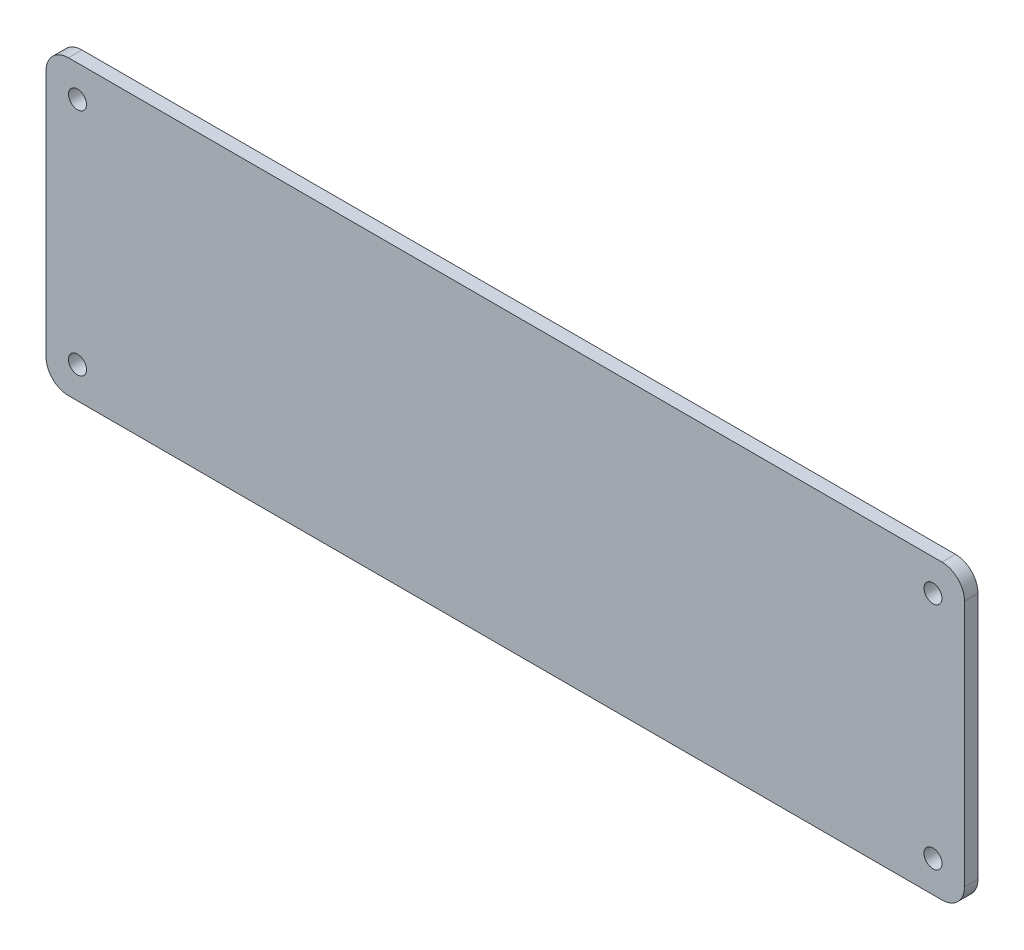
ISO-10303-21;
HEADER;
FILE_DESCRIPTION(('STEP AP214'),'2;1');
FILE_NAME('part.step','',(''),(''),'','','');
FILE_SCHEMA(('AUTOMOTIVE_DESIGN { 1 0 10303 214 1 1 1 1 }'));
ENDSEC;
DATA;
#1=APPLICATION_CONTEXT('core data for automotive mechanical design processes');
#2=APPLICATION_PROTOCOL_DEFINITION('international standard','automotive_design',2000,#1);
#3=PRODUCT_CONTEXT('',#1,'mechanical');
#4=PRODUCT('Part','Part','',(#3));
#5=PRODUCT_RELATED_PRODUCT_CATEGORY('part','',(#4));
#6=PRODUCT_DEFINITION_FORMATION('','',#4);
#7=PRODUCT_DEFINITION_CONTEXT('part definition',#1,'design');
#8=PRODUCT_DEFINITION('design','',#6,#7);
#9=PRODUCT_DEFINITION_SHAPE('','',#8);
#10=(LENGTH_UNIT() NAMED_UNIT(*) SI_UNIT(.MILLI.,.METRE.));
#11=(NAMED_UNIT(*) PLANE_ANGLE_UNIT() SI_UNIT($,.RADIAN.));
#12=(NAMED_UNIT(*) SI_UNIT($,.STERADIAN.) SOLID_ANGLE_UNIT());
#13=UNCERTAINTY_MEASURE_WITH_UNIT(LENGTH_MEASURE(1.E-05),#10,'distance_accuracy_value','');
#14=(GEOMETRIC_REPRESENTATION_CONTEXT(3) GLOBAL_UNCERTAINTY_ASSIGNED_CONTEXT((#13)) GLOBAL_UNIT_ASSIGNED_CONTEXT((#10,
#11,#12)) REPRESENTATION_CONTEXT('',''));
#15=CARTESIAN_POINT('',(0.,0.,0.));
#16=DIRECTION('',(0.,0.,1.));
#17=DIRECTION('',(1.,0.,0.));
#18=AXIS2_PLACEMENT_3D('',#15,#16,#17);
#19=CARTESIAN_POINT('',(0.,0.,1.5));
#20=DIRECTION('',(0.,0.,1.));
#21=DIRECTION('',(1.,0.,0.));
#22=AXIS2_PLACEMENT_3D('',#19,#20,#21);
#23=PLANE('',#22);
#24=CARTESIAN_POINT('',(-95.0000000000001,25.5,1.5));
#25=DIRECTION('',(0.,0.,1.));
#26=DIRECTION('',(1.,0.,0.));
#27=AXIS2_PLACEMENT_3D('',#24,#25,#26);
#28=CIRCLE('',#27,2.);
#29=CARTESIAN_POINT('',(-93.0000000000001,25.5,1.5));
#30=VERTEX_POINT('',#29);
#31=EDGE_CURVE('E199',#30,#30,#28,.T.);
#32=ORIENTED_EDGE('',*,*,#31,.F.);
#33=EDGE_LOOP('',(#32));
#34=FACE_BOUND('',#33,.T.);
#35=CARTESIAN_POINT('',(95.,-25.5,1.5));
#36=DIRECTION('',(0.,0.,1.));
#37=DIRECTION('',(1.,0.,0.));
#38=AXIS2_PLACEMENT_3D('',#35,#36,#37);
#39=CIRCLE('',#38,2.);
#40=CARTESIAN_POINT('',(97.,-25.5,1.5));
#41=VERTEX_POINT('',#40);
#42=EDGE_CURVE('E185',#41,#41,#39,.T.);
#43=ORIENTED_EDGE('',*,*,#42,.F.);
#44=EDGE_LOOP('',(#43));
#45=FACE_BOUND('',#44,.T.);
#46=DIRECTION('',(-1.,0.,0.));
#47=VECTOR('',#46,1.);
#48=CARTESIAN_POINT('',(-102.,32.5,1.5));
#49=LINE('',#48,#47);
#50=CARTESIAN_POINT('',(97.,32.5,1.5));
#51=VERTEX_POINT('',#50);
#52=CARTESIAN_POINT('',(-97.,32.5,1.5));
#53=VERTEX_POINT('',#52);
#54=EDGE_CURVE('E180',#51,#53,#49,.T.);
#55=ORIENTED_EDGE('',*,*,#54,.T.);
#56=CARTESIAN_POINT('',(-97.,27.5,1.5));
#57=DIRECTION('',(0.,0.,1.));
#58=DIRECTION('',(1.,0.,0.));
#59=AXIS2_PLACEMENT_3D('',#56,#57,#58);
#60=CIRCLE('',#59,5.);
#61=CARTESIAN_POINT('',(-102.,27.5,1.5));
#62=VERTEX_POINT('',#61);
#63=EDGE_CURVE('E161',#53,#62,#60,.T.);
#64=ORIENTED_EDGE('',*,*,#63,.T.);
#65=DIRECTION('',(0.,-1.,0.));
#66=VECTOR('',#65,1.);
#67=CARTESIAN_POINT('',(-102.,32.5,1.5));
#68=LINE('',#67,#66);
#69=CARTESIAN_POINT('',(-102.,-27.5,1.5));
#70=VERTEX_POINT('',#69);
#71=EDGE_CURVE('E131',#62,#70,#68,.T.);
#72=ORIENTED_EDGE('',*,*,#71,.T.);
#73=CARTESIAN_POINT('',(-97.,-27.5,1.5));
#74=DIRECTION('',(0.,0.,1.));
#75=DIRECTION('',(1.,0.,0.));
#76=AXIS2_PLACEMENT_3D('',#73,#74,#75);
#77=CIRCLE('',#76,5.);
#78=CARTESIAN_POINT('',(-97.,-32.5,1.5));
#79=VERTEX_POINT('',#78);
#80=EDGE_CURVE('E67',#70,#79,#77,.T.);
#81=ORIENTED_EDGE('',*,*,#80,.T.);
#82=DIRECTION('',(1.,0.,0.));
#83=VECTOR('',#82,1.);
#84=CARTESIAN_POINT('',(-102.,-32.5,1.5));
#85=LINE('',#84,#83);
#86=CARTESIAN_POINT('',(97.,-32.5,1.5));
#87=VERTEX_POINT('',#86);
#88=EDGE_CURVE('E147',#79,#87,#85,.T.);
#89=ORIENTED_EDGE('',*,*,#88,.T.);
#90=CARTESIAN_POINT('',(97.,-27.5,1.5));
#91=DIRECTION('',(0.,0.,1.));
#92=DIRECTION('',(1.,0.,0.));
#93=AXIS2_PLACEMENT_3D('',#90,#91,#92);
#94=CIRCLE('',#93,5.);
#95=CARTESIAN_POINT('',(102.,-27.5,1.5));
#96=VERTEX_POINT('',#95);
#97=EDGE_CURVE('E158',#87,#96,#94,.T.);
#98=ORIENTED_EDGE('',*,*,#97,.T.);
#99=DIRECTION('',(0.,1.,0.));
#100=VECTOR('',#99,1.);
#101=CARTESIAN_POINT('',(102.,32.5,1.5));
#102=LINE('',#101,#100);
#103=CARTESIAN_POINT('',(102.,27.5,1.5));
#104=VERTEX_POINT('',#103);
#105=EDGE_CURVE('E141',#96,#104,#102,.T.);
#106=ORIENTED_EDGE('',*,*,#105,.T.);
#107=CARTESIAN_POINT('',(97.,27.5,1.5));
#108=DIRECTION('',(0.,0.,1.));
#109=DIRECTION('',(1.,0.,0.));
#110=AXIS2_PLACEMENT_3D('',#107,#108,#109);
#111=CIRCLE('',#110,5.);
#112=EDGE_CURVE('E156',#104,#51,#111,.T.);
#113=ORIENTED_EDGE('',*,*,#112,.T.);
#114=EDGE_LOOP('',(#55,#64,#72,#81,#89,#98,#106,#113));
#115=FACE_BOUND('',#114,.T.);
#116=CARTESIAN_POINT('',(95.,25.5,1.5));
#117=DIRECTION('',(0.,0.,1.));
#118=DIRECTION('',(1.,0.,0.));
#119=AXIS2_PLACEMENT_3D('',#116,#117,#118);
#120=CIRCLE('',#119,2.);
#121=CARTESIAN_POINT('',(97.,25.5,1.5));
#122=VERTEX_POINT('',#121);
#123=EDGE_CURVE('E194',#122,#122,#120,.T.);
#124=ORIENTED_EDGE('',*,*,#123,.F.);
#125=EDGE_LOOP('',(#124));
#126=FACE_BOUND('',#125,.T.);
#127=CARTESIAN_POINT('',(-95.0000000000001,-25.5,1.5));
#128=DIRECTION('',(0.,0.,1.));
#129=DIRECTION('',(1.,0.,0.));
#130=AXIS2_PLACEMENT_3D('',#127,#128,#129);
#131=CIRCLE('',#130,2.);
#132=CARTESIAN_POINT('',(-93.0000000000001,-25.5,1.5));
#133=VERTEX_POINT('',#132);
#134=EDGE_CURVE('E205',#133,#133,#131,.T.);
#135=ORIENTED_EDGE('',*,*,#134,.F.);
#136=EDGE_LOOP('',(#135));
#137=FACE_BOUND('',#136,.T.);
#138=ADVANCED_FACE('F45',(#34,#45,#115,#126,#137),#23,.T.);
#139=CARTESIAN_POINT('',(0.,0.,-1.5));
#140=DIRECTION('',(0.,0.,1.));
#141=DIRECTION('',(1.,0.,0.));
#142=AXIS2_PLACEMENT_3D('',#139,#140,#141);
#143=PLANE('',#142);
#144=DIRECTION('',(0.,-1.,0.));
#145=VECTOR('',#144,1.);
#146=CARTESIAN_POINT('',(-102.,32.5,-1.5));
#147=LINE('',#146,#145);
#148=CARTESIAN_POINT('',(-102.,27.5,-1.5));
#149=VERTEX_POINT('',#148);
#150=CARTESIAN_POINT('',(-102.,-27.5,-1.5));
#151=VERTEX_POINT('',#150);
#152=EDGE_CURVE('E129',#149,#151,#147,.T.);
#153=ORIENTED_EDGE('',*,*,#152,.F.);
#154=CARTESIAN_POINT('',(-97.,27.5,-1.5));
#155=DIRECTION('',(0.,0.,1.));
#156=DIRECTION('',(1.,0.,0.));
#157=AXIS2_PLACEMENT_3D('',#154,#155,#156);
#158=CIRCLE('',#157,5.);
#159=CARTESIAN_POINT('',(-97.,32.5,-1.5));
#160=VERTEX_POINT('',#159);
#161=EDGE_CURVE('E112',#149,#160,#158,.F.);
#162=ORIENTED_EDGE('',*,*,#161,.T.);
#163=DIRECTION('',(-1.,0.,0.));
#164=VECTOR('',#163,1.);
#165=CARTESIAN_POINT('',(-102.,32.5,-1.5));
#166=LINE('',#165,#164);
#167=CARTESIAN_POINT('',(97.,32.5,-1.5));
#168=VERTEX_POINT('',#167);
#169=EDGE_CURVE('E139',#168,#160,#166,.T.);
#170=ORIENTED_EDGE('',*,*,#169,.F.);
#171=CARTESIAN_POINT('',(97.,27.5,-1.5));
#172=DIRECTION('',(0.,0.,1.));
#173=DIRECTION('',(1.,0.,0.));
#174=AXIS2_PLACEMENT_3D('',#171,#172,#173);
#175=CIRCLE('',#174,5.);
#176=CARTESIAN_POINT('',(102.,27.5,-1.5));
#177=VERTEX_POINT('',#176);
#178=EDGE_CURVE('E132',#168,#177,#175,.F.);
#179=ORIENTED_EDGE('',*,*,#178,.T.);
#180=DIRECTION('',(0.,1.,0.));
#181=VECTOR('',#180,1.);
#182=CARTESIAN_POINT('',(102.,32.5,-1.5));
#183=LINE('',#182,#181);
#184=CARTESIAN_POINT('',(102.,-27.5,-1.5));
#185=VERTEX_POINT('',#184);
#186=EDGE_CURVE('E143',#185,#177,#183,.T.);
#187=ORIENTED_EDGE('',*,*,#186,.F.);
#188=CARTESIAN_POINT('',(97.,-27.5,-1.5));
#189=DIRECTION('',(0.,0.,1.));
#190=DIRECTION('',(1.,0.,0.));
#191=AXIS2_PLACEMENT_3D('',#188,#189,#190);
#192=CIRCLE('',#191,5.);
#193=CARTESIAN_POINT('',(97.,-32.5,-1.5));
#194=VERTEX_POINT('',#193);
#195=EDGE_CURVE('E150',#185,#194,#192,.F.);
#196=ORIENTED_EDGE('',*,*,#195,.T.);
#197=DIRECTION('',(1.,0.,0.));
#198=VECTOR('',#197,1.);
#199=CARTESIAN_POINT('',(-102.,-32.5,-1.5));
#200=LINE('',#199,#198);
#201=CARTESIAN_POINT('',(-97.,-32.5,-1.5));
#202=VERTEX_POINT('',#201);
#203=EDGE_CURVE('E138',#202,#194,#200,.T.);
#204=ORIENTED_EDGE('',*,*,#203,.F.);
#205=CARTESIAN_POINT('',(-97.,-27.5,-1.5));
#206=DIRECTION('',(0.,0.,1.));
#207=DIRECTION('',(1.,0.,0.));
#208=AXIS2_PLACEMENT_3D('',#205,#206,#207);
#209=CIRCLE('',#208,5.);
#210=EDGE_CURVE('E123',#202,#151,#209,.F.);
#211=ORIENTED_EDGE('',*,*,#210,.T.);
#212=EDGE_LOOP('',(#153,#162,#170,#179,#187,#196,#204,#211));
#213=FACE_BOUND('',#212,.T.);
#214=CARTESIAN_POINT('',(95.,-25.5,-1.5));
#215=DIRECTION('',(0.,0.,1.));
#216=DIRECTION('',(1.,0.,0.));
#217=AXIS2_PLACEMENT_3D('',#214,#215,#216);
#218=CIRCLE('',#217,2.);
#219=CARTESIAN_POINT('',(97.,-25.5,-1.5));
#220=VERTEX_POINT('',#219);
#221=EDGE_CURVE('E187',#220,#220,#218,.T.);
#222=ORIENTED_EDGE('',*,*,#221,.T.);
#223=EDGE_LOOP('',(#222));
#224=FACE_BOUND('',#223,.T.);
#225=CARTESIAN_POINT('',(95.,25.5,-1.5));
#226=DIRECTION('',(0.,0.,1.));
#227=DIRECTION('',(1.,0.,0.));
#228=AXIS2_PLACEMENT_3D('',#225,#226,#227);
#229=CIRCLE('',#228,2.);
#230=CARTESIAN_POINT('',(97.,25.5,-1.5));
#231=VERTEX_POINT('',#230);
#232=EDGE_CURVE('E196',#231,#231,#229,.T.);
#233=ORIENTED_EDGE('',*,*,#232,.T.);
#234=EDGE_LOOP('',(#233));
#235=FACE_BOUND('',#234,.T.);
#236=CARTESIAN_POINT('',(-95.0000000000001,25.5,-1.5));
#237=DIRECTION('',(0.,0.,1.));
#238=DIRECTION('',(1.,0.,0.));
#239=AXIS2_PLACEMENT_3D('',#236,#237,#238);
#240=CIRCLE('',#239,2.);
#241=CARTESIAN_POINT('',(-93.0000000000001,25.5,-1.5));
#242=VERTEX_POINT('',#241);
#243=EDGE_CURVE('E202',#242,#242,#240,.T.);
#244=ORIENTED_EDGE('',*,*,#243,.T.);
#245=EDGE_LOOP('',(#244));
#246=FACE_BOUND('',#245,.T.);
#247=CARTESIAN_POINT('',(-95.0000000000001,-25.5,-1.5));
#248=DIRECTION('',(0.,0.,1.));
#249=DIRECTION('',(1.,0.,0.));
#250=AXIS2_PLACEMENT_3D('',#247,#248,#249);
#251=CIRCLE('',#250,2.);
#252=CARTESIAN_POINT('',(-93.0000000000001,-25.5,-1.5));
#253=VERTEX_POINT('',#252);
#254=EDGE_CURVE('E208',#253,#253,#251,.T.);
#255=ORIENTED_EDGE('',*,*,#254,.T.);
#256=EDGE_LOOP('',(#255));
#257=FACE_BOUND('',#256,.T.);
#258=ADVANCED_FACE('F135',(#213,#224,#235,#246,#257),#143,.F.);
#259=CARTESIAN_POINT('',(102.,32.5,1.5));
#260=DIRECTION('',(-1.,0.,0.));
#261=DIRECTION('',(0.,0.,1.));
#262=AXIS2_PLACEMENT_3D('',#259,#260,#261);
#263=PLANE('',#262);
#264=ORIENTED_EDGE('',*,*,#105,.F.);
#265=DIRECTION('',(0.,0.,-1.));
#266=VECTOR('',#265,1.);
#267=CARTESIAN_POINT('',(102.,-27.5,1.5));
#268=LINE('',#267,#266);
#269=EDGE_CURVE('E11',#96,#185,#268,.T.);
#270=ORIENTED_EDGE('',*,*,#269,.T.);
#271=ORIENTED_EDGE('',*,*,#186,.T.);
#272=DIRECTION('',(0.,0.,-1.));
#273=VECTOR('',#272,1.);
#274=CARTESIAN_POINT('',(102.,27.5,1.5));
#275=LINE('',#274,#273);
#276=EDGE_CURVE('E53',#177,#104,#275,.F.);
#277=ORIENTED_EDGE('',*,*,#276,.T.);
#278=EDGE_LOOP('',(#264,#270,#271,#277));
#279=FACE_BOUND('',#278,.T.);
#280=ADVANCED_FACE('F171',(#279),#263,.F.);
#281=CARTESIAN_POINT('',(-102.,32.5,1.5));
#282=DIRECTION('',(0.,-1.,0.));
#283=DIRECTION('',(0.,0.,-1.));
#284=AXIS2_PLACEMENT_3D('',#281,#282,#283);
#285=PLANE('',#284);
#286=ORIENTED_EDGE('',*,*,#169,.T.);
#287=DIRECTION('',(0.,0.,-1.));
#288=VECTOR('',#287,1.);
#289=CARTESIAN_POINT('',(-97.,32.5,1.5));
#290=LINE('',#289,#288);
#291=EDGE_CURVE('E117',#160,#53,#290,.F.);
#292=ORIENTED_EDGE('',*,*,#291,.T.);
#293=ORIENTED_EDGE('',*,*,#54,.F.);
#294=DIRECTION('',(0.,0.,-1.));
#295=VECTOR('',#294,1.);
#296=CARTESIAN_POINT('',(97.,32.5,1.5));
#297=LINE('',#296,#295);
#298=EDGE_CURVE('E122',#51,#168,#297,.T.);
#299=ORIENTED_EDGE('',*,*,#298,.T.);
#300=EDGE_LOOP('',(#286,#292,#293,#299));
#301=FACE_BOUND('',#300,.T.);
#302=ADVANCED_FACE('F184',(#301),#285,.F.);
#303=CARTESIAN_POINT('',(-102.,32.5,1.5));
#304=DIRECTION('',(1.,0.,0.));
#305=DIRECTION('',(0.,1.,0.));
#306=AXIS2_PLACEMENT_3D('',#303,#304,#305);
#307=PLANE('',#306);
#308=ORIENTED_EDGE('',*,*,#71,.F.);
#309=DIRECTION('',(0.,0.,-1.));
#310=VECTOR('',#309,1.);
#311=CARTESIAN_POINT('',(-102.,27.5,1.5));
#312=LINE('',#311,#310);
#313=EDGE_CURVE('E116',#62,#149,#312,.T.);
#314=ORIENTED_EDGE('',*,*,#313,.T.);
#315=ORIENTED_EDGE('',*,*,#152,.T.);
#316=DIRECTION('',(0.,0.,-1.));
#317=VECTOR('',#316,1.);
#318=CARTESIAN_POINT('',(-102.,-27.5,1.5));
#319=LINE('',#318,#317);
#320=EDGE_CURVE('E133',#151,#70,#319,.F.);
#321=ORIENTED_EDGE('',*,*,#320,.T.);
#322=EDGE_LOOP('',(#308,#314,#315,#321));
#323=FACE_BOUND('',#322,.T.);
#324=ADVANCED_FACE('F128',(#323),#307,.F.);
#325=CARTESIAN_POINT('',(-102.,-32.5,1.5));
#326=DIRECTION('',(0.,1.,0.));
#327=DIRECTION('',(0.,0.,1.));
#328=AXIS2_PLACEMENT_3D('',#325,#326,#327);
#329=PLANE('',#328);
#330=ORIENTED_EDGE('',*,*,#88,.F.);
#331=DIRECTION('',(0.,0.,-1.));
#332=VECTOR('',#331,1.);
#333=CARTESIAN_POINT('',(-97.,-32.5,1.5));
#334=LINE('',#333,#332);
#335=EDGE_CURVE('E164',#79,#202,#334,.T.);
#336=ORIENTED_EDGE('',*,*,#335,.T.);
#337=ORIENTED_EDGE('',*,*,#203,.T.);
#338=DIRECTION('',(0.,0.,-1.));
#339=VECTOR('',#338,1.);
#340=CARTESIAN_POINT('',(97.,-32.5,1.5));
#341=LINE('',#340,#339);
#342=EDGE_CURVE('E60',#194,#87,#341,.F.);
#343=ORIENTED_EDGE('',*,*,#342,.T.);
#344=EDGE_LOOP('',(#330,#336,#337,#343));
#345=FACE_BOUND('',#344,.T.);
#346=ADVANCED_FACE('F230',(#345),#329,.F.);
#347=CARTESIAN_POINT('',(95.,-25.5,1.5));
#348=DIRECTION('',(0.,0.,-1.));
#349=DIRECTION('',(-1.,0.,0.));
#350=AXIS2_PLACEMENT_3D('',#347,#348,#349);
#351=CYLINDRICAL_SURFACE('',#350,2.);
#352=ORIENTED_EDGE('',*,*,#42,.T.);
#353=EDGE_LOOP('',(#352));
#354=FACE_BOUND('',#353,.T.);
#355=ORIENTED_EDGE('',*,*,#221,.F.);
#356=EDGE_LOOP('',(#355));
#357=FACE_BOUND('',#356,.T.);
#358=ADVANCED_FACE('F227',(#354,#357),#351,.F.);
#359=CARTESIAN_POINT('',(95.,25.5,1.5));
#360=DIRECTION('',(0.,0.,-1.));
#361=DIRECTION('',(-1.,0.,0.));
#362=AXIS2_PLACEMENT_3D('',#359,#360,#361);
#363=CYLINDRICAL_SURFACE('',#362,2.);
#364=ORIENTED_EDGE('',*,*,#123,.T.);
#365=EDGE_LOOP('',(#364));
#366=FACE_BOUND('',#365,.T.);
#367=ORIENTED_EDGE('',*,*,#232,.F.);
#368=EDGE_LOOP('',(#367));
#369=FACE_BOUND('',#368,.T.);
#370=ADVANCED_FACE('F287',(#366,#369),#363,.F.);
#371=CARTESIAN_POINT('',(-95.0000000000001,25.5,1.5));
#372=DIRECTION('',(0.,0.,-1.));
#373=DIRECTION('',(-1.,0.,0.));
#374=AXIS2_PLACEMENT_3D('',#371,#372,#373);
#375=CYLINDRICAL_SURFACE('',#374,2.);
#376=ORIENTED_EDGE('',*,*,#31,.T.);
#377=EDGE_LOOP('',(#376));
#378=FACE_BOUND('',#377,.T.);
#379=ORIENTED_EDGE('',*,*,#243,.F.);
#380=EDGE_LOOP('',(#379));
#381=FACE_BOUND('',#380,.T.);
#382=ADVANCED_FACE('F278',(#378,#381),#375,.F.);
#383=CARTESIAN_POINT('',(-95.0000000000001,-25.5,1.5));
#384=DIRECTION('',(0.,0.,-1.));
#385=DIRECTION('',(-1.,0.,0.));
#386=AXIS2_PLACEMENT_3D('',#383,#384,#385);
#387=CYLINDRICAL_SURFACE('',#386,2.);
#388=ORIENTED_EDGE('',*,*,#134,.T.);
#389=EDGE_LOOP('',(#388));
#390=FACE_BOUND('',#389,.T.);
#391=ORIENTED_EDGE('',*,*,#254,.F.);
#392=EDGE_LOOP('',(#391));
#393=FACE_BOUND('',#392,.T.);
#394=ADVANCED_FACE('F214',(#390,#393),#387,.F.);
#395=CARTESIAN_POINT('',(-97.,27.5,1.5));
#396=DIRECTION('',(0.,0.,-1.));
#397=DIRECTION('',(-1.,0.,0.));
#398=AXIS2_PLACEMENT_3D('',#395,#396,#397);
#399=CYLINDRICAL_SURFACE('',#398,5.);
#400=ORIENTED_EDGE('',*,*,#63,.F.);
#401=ORIENTED_EDGE('',*,*,#291,.F.);
#402=ORIENTED_EDGE('',*,*,#161,.F.);
#403=ORIENTED_EDGE('',*,*,#313,.F.);
#404=EDGE_LOOP('',(#400,#401,#402,#403));
#405=FACE_BOUND('',#404,.T.);
#406=ADVANCED_FACE('F115',(#405),#399,.T.);
#407=CARTESIAN_POINT('',(-97.,-27.5,1.5));
#408=DIRECTION('',(0.,0.,-1.));
#409=DIRECTION('',(-1.,0.,0.));
#410=AXIS2_PLACEMENT_3D('',#407,#408,#409);
#411=CYLINDRICAL_SURFACE('',#410,5.);
#412=ORIENTED_EDGE('',*,*,#80,.F.);
#413=ORIENTED_EDGE('',*,*,#320,.F.);
#414=ORIENTED_EDGE('',*,*,#210,.F.);
#415=ORIENTED_EDGE('',*,*,#335,.F.);
#416=EDGE_LOOP('',(#412,#413,#414,#415));
#417=FACE_BOUND('',#416,.T.);
#418=ADVANCED_FACE('F241',(#417),#411,.T.);
#419=CARTESIAN_POINT('',(97.,-27.5,1.5));
#420=DIRECTION('',(0.,0.,-1.));
#421=DIRECTION('',(-1.,0.,0.));
#422=AXIS2_PLACEMENT_3D('',#419,#420,#421);
#423=CYLINDRICAL_SURFACE('',#422,5.);
#424=ORIENTED_EDGE('',*,*,#97,.F.);
#425=ORIENTED_EDGE('',*,*,#342,.F.);
#426=ORIENTED_EDGE('',*,*,#195,.F.);
#427=ORIENTED_EDGE('',*,*,#269,.F.);
#428=EDGE_LOOP('',(#424,#425,#426,#427));
#429=FACE_BOUND('',#428,.T.);
#430=ADVANCED_FACE('F243',(#429),#423,.T.);
#431=CARTESIAN_POINT('',(97.,27.5,1.5));
#432=DIRECTION('',(0.,0.,-1.));
#433=DIRECTION('',(-1.,0.,0.));
#434=AXIS2_PLACEMENT_3D('',#431,#432,#433);
#435=CYLINDRICAL_SURFACE('',#434,5.);
#436=ORIENTED_EDGE('',*,*,#112,.F.);
#437=ORIENTED_EDGE('',*,*,#276,.F.);
#438=ORIENTED_EDGE('',*,*,#178,.F.);
#439=ORIENTED_EDGE('',*,*,#298,.F.);
#440=EDGE_LOOP('',(#436,#437,#438,#439));
#441=FACE_BOUND('',#440,.T.);
#442=ADVANCED_FACE('F47',(#441),#435,.T.);
#443=CLOSED_SHELL('',(#138,#258,#280,#302,#324,#346,#358,#370,#382,#394,#406,#418,#430,#442));
#444=MANIFOLD_SOLID_BREP('B2',#443);
#445=ADVANCED_BREP_SHAPE_REPRESENTATION('',(#18,#444),#14);
#446=SHAPE_DEFINITION_REPRESENTATION(#9,#445);
ENDSEC;
END-ISO-10303-21;
